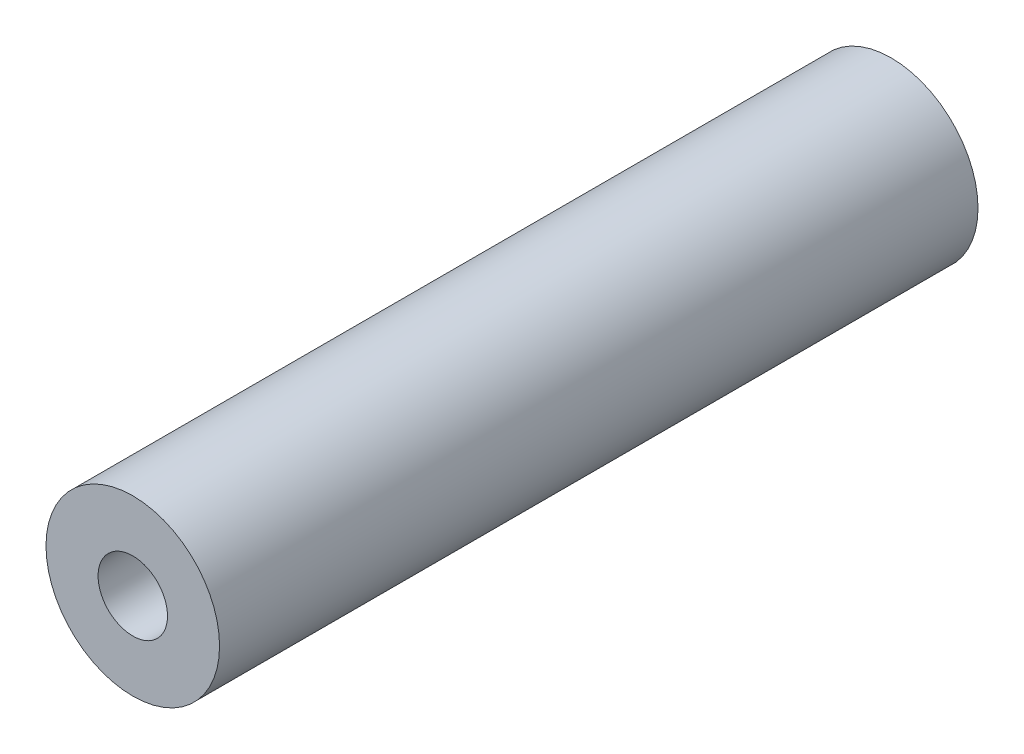
ISO-10303-21;
HEADER;
FILE_DESCRIPTION(('STEP AP214'),'2;1');
FILE_NAME('part.step','',(''),(''),'','','');
FILE_SCHEMA(('AUTOMOTIVE_DESIGN { 1 0 10303 214 1 1 1 1 }'));
ENDSEC;
DATA;
#1=APPLICATION_CONTEXT('core data for automotive mechanical design processes');
#2=APPLICATION_PROTOCOL_DEFINITION('international standard','automotive_design',2000,#1);
#3=PRODUCT_CONTEXT('',#1,'mechanical');
#4=PRODUCT('Part','Part','',(#3));
#5=PRODUCT_RELATED_PRODUCT_CATEGORY('part','',(#4));
#6=PRODUCT_DEFINITION_FORMATION('','',#4);
#7=PRODUCT_DEFINITION_CONTEXT('part definition',#1,'design');
#8=PRODUCT_DEFINITION('design','',#6,#7);
#9=PRODUCT_DEFINITION_SHAPE('','',#8);
#10=(LENGTH_UNIT() NAMED_UNIT(*) SI_UNIT(.MILLI.,.METRE.));
#11=(NAMED_UNIT(*) PLANE_ANGLE_UNIT() SI_UNIT($,.RADIAN.));
#12=(NAMED_UNIT(*) SI_UNIT($,.STERADIAN.) SOLID_ANGLE_UNIT());
#13=UNCERTAINTY_MEASURE_WITH_UNIT(LENGTH_MEASURE(1.E-05),#10,'distance_accuracy_value','');
#14=(GEOMETRIC_REPRESENTATION_CONTEXT(3) GLOBAL_UNCERTAINTY_ASSIGNED_CONTEXT((#13)) GLOBAL_UNIT_ASSIGNED_CONTEXT((#10,
#11,#12)) REPRESENTATION_CONTEXT('',''));
#15=CARTESIAN_POINT('',(0.,0.,0.));
#16=DIRECTION('',(0.,0.,1.));
#17=DIRECTION('',(1.,0.,0.));
#18=AXIS2_PLACEMENT_3D('',#15,#16,#17);
#19=CARTESIAN_POINT('',(0.,0.,43.7));
#20=DIRECTION('',(0.,0.,1.));
#21=DIRECTION('',(1.,0.,0.));
#22=AXIS2_PLACEMENT_3D('',#19,#20,#21);
#23=PLANE('',#22);
#24=CARTESIAN_POINT('',(0.,0.,43.7));
#25=DIRECTION('',(0.,0.,1.));
#26=DIRECTION('',(1.,0.,0.));
#27=AXIS2_PLACEMENT_3D('',#24,#25,#26);
#28=CIRCLE('',#27,5.);
#29=CARTESIAN_POINT('',(5.,0.,43.7));
#30=VERTEX_POINT('',#29);
#31=EDGE_CURVE('E10',#30,#30,#28,.T.);
#32=ORIENTED_EDGE('',*,*,#31,.T.);
#33=EDGE_LOOP('',(#32));
#34=FACE_BOUND('',#33,.T.);
#35=CARTESIAN_POINT('',(0.,0.,43.7));
#36=DIRECTION('',(0.,0.,1.));
#37=DIRECTION('',(1.,0.,0.));
#38=AXIS2_PLACEMENT_3D('',#35,#36,#37);
#39=CIRCLE('',#38,2.);
#40=CARTESIAN_POINT('',(2.,0.,43.7));
#41=VERTEX_POINT('',#40);
#42=EDGE_CURVE('E44',#41,#41,#39,.T.);
#43=ORIENTED_EDGE('',*,*,#42,.F.);
#44=EDGE_LOOP('',(#43));
#45=FACE_BOUND('',#44,.T.);
#46=ADVANCED_FACE('F33',(#34,#45),#23,.T.);
#47=CARTESIAN_POINT('',(0.,0.,0.));
#48=DIRECTION('',(0.,0.,1.));
#49=DIRECTION('',(1.,0.,0.));
#50=AXIS2_PLACEMENT_3D('',#47,#48,#49);
#51=PLANE('',#50);
#52=CARTESIAN_POINT('',(0.,0.,0.));
#53=DIRECTION('',(0.,0.,1.));
#54=DIRECTION('',(1.,0.,0.));
#55=AXIS2_PLACEMENT_3D('',#52,#53,#54);
#56=CIRCLE('',#55,5.);
#57=CARTESIAN_POINT('',(5.,0.,0.));
#58=VERTEX_POINT('',#57);
#59=EDGE_CURVE('E37',#58,#58,#56,.T.);
#60=ORIENTED_EDGE('',*,*,#59,.F.);
#61=EDGE_LOOP('',(#60));
#62=FACE_BOUND('',#61,.T.);
#63=CARTESIAN_POINT('',(0.,0.,0.));
#64=DIRECTION('',(0.,0.,1.));
#65=DIRECTION('',(1.,0.,0.));
#66=AXIS2_PLACEMENT_3D('',#63,#64,#65);
#67=CIRCLE('',#66,2.);
#68=CARTESIAN_POINT('',(2.,0.,0.));
#69=VERTEX_POINT('',#68);
#70=EDGE_CURVE('E46',#69,#69,#67,.T.);
#71=ORIENTED_EDGE('',*,*,#70,.T.);
#72=EDGE_LOOP('',(#71));
#73=FACE_BOUND('',#72,.T.);
#74=ADVANCED_FACE('F56',(#62,#73),#51,.F.);
#75=CARTESIAN_POINT('',(0.,0.,43.7));
#76=DIRECTION('',(0.,0.,-1.));
#77=DIRECTION('',(-1.,0.,0.));
#78=AXIS2_PLACEMENT_3D('',#75,#76,#77);
#79=CYLINDRICAL_SURFACE('',#78,5.);
#80=ORIENTED_EDGE('',*,*,#31,.F.);
#81=EDGE_LOOP('',(#80));
#82=FACE_BOUND('',#81,.T.);
#83=ORIENTED_EDGE('',*,*,#59,.T.);
#84=EDGE_LOOP('',(#83));
#85=FACE_BOUND('',#84,.T.);
#86=ADVANCED_FACE('F35',(#82,#85),#79,.T.);
#87=CARTESIAN_POINT('',(0.,0.,43.7));
#88=DIRECTION('',(0.,0.,-1.));
#89=DIRECTION('',(-1.,0.,0.));
#90=AXIS2_PLACEMENT_3D('',#87,#88,#89);
#91=CYLINDRICAL_SURFACE('',#90,2.);
#92=ORIENTED_EDGE('',*,*,#42,.T.);
#93=EDGE_LOOP('',(#92));
#94=FACE_BOUND('',#93,.T.);
#95=ORIENTED_EDGE('',*,*,#70,.F.);
#96=EDGE_LOOP('',(#95));
#97=FACE_BOUND('',#96,.T.);
#98=ADVANCED_FACE('F52',(#94,#97),#91,.F.);
#99=CLOSED_SHELL('',(#46,#74,#86,#98));
#100=MANIFOLD_SOLID_BREP('B2',#99);
#101=ADVANCED_BREP_SHAPE_REPRESENTATION('',(#18,#100),#14);
#102=SHAPE_DEFINITION_REPRESENTATION(#9,#101);
ENDSEC;
END-ISO-10303-21;
